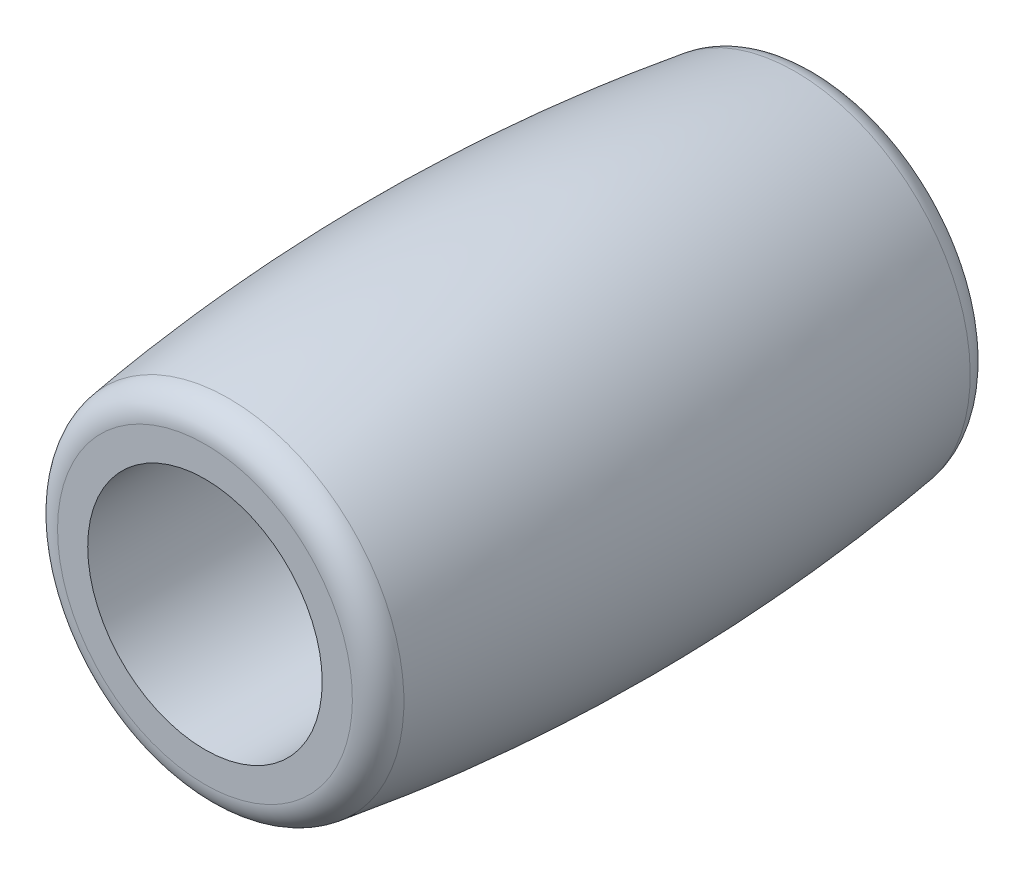
ISO-10303-21;
HEADER;
FILE_DESCRIPTION(('STEP AP214'),'2;1');
FILE_NAME('part.step','',(''),(''),'','','');
FILE_SCHEMA(('AUTOMOTIVE_DESIGN { 1 0 10303 214 1 1 1 1 }'));
ENDSEC;
DATA;
#1=APPLICATION_CONTEXT('core data for automotive mechanical design processes');
#2=APPLICATION_PROTOCOL_DEFINITION('international standard','automotive_design',2000,#1);
#3=PRODUCT_CONTEXT('',#1,'mechanical');
#4=PRODUCT('Part','Part','',(#3));
#5=PRODUCT_RELATED_PRODUCT_CATEGORY('part','',(#4));
#6=PRODUCT_DEFINITION_FORMATION('','',#4);
#7=PRODUCT_DEFINITION_CONTEXT('part definition',#1,'design');
#8=PRODUCT_DEFINITION('design','',#6,#7);
#9=PRODUCT_DEFINITION_SHAPE('','',#8);
#10=(LENGTH_UNIT() NAMED_UNIT(*) SI_UNIT(.MILLI.,.METRE.));
#11=(NAMED_UNIT(*) PLANE_ANGLE_UNIT() SI_UNIT($,.RADIAN.));
#12=(NAMED_UNIT(*) SI_UNIT($,.STERADIAN.) SOLID_ANGLE_UNIT());
#13=UNCERTAINTY_MEASURE_WITH_UNIT(LENGTH_MEASURE(1.E-05),#10,'distance_accuracy_value','');
#14=(GEOMETRIC_REPRESENTATION_CONTEXT(3) GLOBAL_UNCERTAINTY_ASSIGNED_CONTEXT((#13)) GLOBAL_UNIT_ASSIGNED_CONTEXT((#10,
#11,#12)) REPRESENTATION_CONTEXT('',''));
#15=CARTESIAN_POINT('',(0.,0.,0.));
#16=DIRECTION('',(0.,0.,1.));
#17=DIRECTION('',(1.,0.,0.));
#18=AXIS2_PLACEMENT_3D('',#15,#16,#17);
#19=CARTESIAN_POINT('',(0.,0.,6.27));
#20=DIRECTION('',(0.,0.,-1.));
#21=DIRECTION('',(-1.,0.,0.));
#22=AXIS2_PLACEMENT_3D('',#19,#20,#21);
#23=CYLINDRICAL_SURFACE('',#22,1.65);
#24=CARTESIAN_POINT('',(0.,0.,-0.65));
#25=DIRECTION('',(0.,0.,-1.));
#26=DIRECTION('',(-1.,0.,0.));
#27=AXIS2_PLACEMENT_3D('',#24,#25,#26);
#28=CIRCLE('',#27,1.65);
#29=CARTESIAN_POINT('',(-1.65,0.,-0.65));
#30=VERTEX_POINT('',#29);
#31=EDGE_CURVE('E22',#30,#30,#28,.T.);
#32=ORIENTED_EDGE('',*,*,#31,.F.);
#33=EDGE_LOOP('',(#32));
#34=FACE_BOUND('',#33,.T.);
#35=CARTESIAN_POINT('',(0.,0.,-4.15));
#36=DIRECTION('',(0.,0.,-1.));
#37=DIRECTION('',(-1.,0.,0.));
#38=AXIS2_PLACEMENT_3D('',#35,#36,#37);
#39=CIRCLE('',#38,1.65);
#40=CARTESIAN_POINT('',(-1.65,0.,-4.15));
#41=VERTEX_POINT('',#40);
#42=EDGE_CURVE('E125',#41,#41,#39,.T.);
#43=ORIENTED_EDGE('',*,*,#42,.T.);
#44=EDGE_LOOP('',(#43));
#45=FACE_BOUND('',#44,.T.);
#46=ADVANCED_FACE('F17',(#34,#45),#23,.F.);
#47=CARTESIAN_POINT('',(0.,0.,-0.65));
#48=DIRECTION('',(0.,0.,1.));
#49=DIRECTION('',(1.,0.,0.));
#50=AXIS2_PLACEMENT_3D('',#47,#48,#49);
#51=PLANE('',#50);
#52=CARTESIAN_POINT('',(0.,0.,-0.65));
#53=DIRECTION('',(0.,0.,1.));
#54=DIRECTION('',(1.,0.,0.));
#55=AXIS2_PLACEMENT_3D('',#52,#53,#54);
#56=CIRCLE('',#55,2.1);
#57=CARTESIAN_POINT('',(2.1,0.,-0.65));
#58=VERTEX_POINT('',#57);
#59=EDGE_CURVE('E123',#58,#58,#56,.T.);
#60=ORIENTED_EDGE('',*,*,#59,.T.);
#61=EDGE_LOOP('',(#60));
#62=FACE_BOUND('',#61,.T.);
#63=ORIENTED_EDGE('',*,*,#31,.T.);
#64=EDGE_LOOP('',(#63));
#65=FACE_BOUND('',#64,.T.);
#66=ADVANCED_FACE('F132',(#62,#65),#51,.T.);
#67=CARTESIAN_POINT('',(0.,0.,-4.15));
#68=DIRECTION('',(0.,0.,1.));
#69=DIRECTION('',(1.,0.,0.));
#70=AXIS2_PLACEMENT_3D('',#67,#68,#69);
#71=PLANE('',#70);
#72=CARTESIAN_POINT('',(0.,0.,-4.15));
#73=DIRECTION('',(0.,0.,1.));
#74=DIRECTION('',(1.,0.,0.));
#75=AXIS2_PLACEMENT_3D('',#72,#73,#74);
#76=CIRCLE('',#75,2.1);
#77=CARTESIAN_POINT('',(2.1,0.,-4.15));
#78=VERTEX_POINT('',#77);
#79=EDGE_CURVE('E68',#78,#78,#76,.F.);
#80=ORIENTED_EDGE('',*,*,#79,.T.);
#81=EDGE_LOOP('',(#80));
#82=FACE_BOUND('',#81,.T.);
#83=ORIENTED_EDGE('',*,*,#42,.F.);
#84=EDGE_LOOP('',(#83));
#85=FACE_BOUND('',#84,.T.);
#86=ADVANCED_FACE('F138',(#82,#85),#71,.F.);
#87=CARTESIAN_POINT('',(0.,0.,-9.568995074674));
#88=DIRECTION('',(0.,0.,1.));
#89=DIRECTION('',(1.,0.,0.));
#90=AXIS2_PLACEMENT_3D('',#87,#88,#89);
#91=CYLINDRICAL_SURFACE('',#90,2.1);
#92=ORIENTED_EDGE('',*,*,#59,.F.);
#93=EDGE_LOOP('',(#92));
#94=FACE_BOUND('',#93,.T.);
#95=CARTESIAN_POINT('',(0.,0.,5.5));
#96=DIRECTION('',(0.,0.,1.));
#97=DIRECTION('',(1.,0.,0.));
#98=AXIS2_PLACEMENT_3D('',#95,#96,#97);
#99=CIRCLE('',#98,2.1);
#100=CARTESIAN_POINT('',(2.1,0.,5.5));
#101=VERTEX_POINT('',#100);
#102=EDGE_CURVE('E62',#101,#101,#99,.T.);
#103=ORIENTED_EDGE('',*,*,#102,.T.);
#104=EDGE_LOOP('',(#103));
#105=FACE_BOUND('',#104,.T.);
#106=ADVANCED_FACE('F143',(#94,#105),#91,.F.);
#107=CARTESIAN_POINT('',(0.,0.,-9.568995074674));
#108=DIRECTION('',(0.,0.,1.));
#109=DIRECTION('',(1.,0.,0.));
#110=AXIS2_PLACEMENT_3D('',#107,#108,#109);
#111=CYLINDRICAL_SURFACE('',#110,2.1);
#112=ORIENTED_EDGE('',*,*,#79,.F.);
#113=EDGE_LOOP('',(#112));
#114=FACE_BOUND('',#113,.T.);
#115=CARTESIAN_POINT('',(0.,0.,-5.5));
#116=DIRECTION('',(0.,0.,1.));
#117=DIRECTION('',(1.,0.,0.));
#118=AXIS2_PLACEMENT_3D('',#115,#116,#117);
#119=CIRCLE('',#118,2.1);
#120=CARTESIAN_POINT('',(2.1,0.,-5.5));
#121=VERTEX_POINT('',#120);
#122=EDGE_CURVE('E61',#121,#121,#119,.T.);
#123=ORIENTED_EDGE('',*,*,#122,.F.);
#124=EDGE_LOOP('',(#123));
#125=FACE_BOUND('',#124,.T.);
#126=ADVANCED_FACE('F149',(#114,#125),#111,.F.);
#127=CARTESIAN_POINT('',(0.,0.,5.5));
#128=DIRECTION('',(0.,0.,-1.));
#129=DIRECTION('',(-1.,0.,0.));
#130=AXIS2_PLACEMENT_3D('',#127,#128,#129);
#131=PLANE('',#130);
#132=CARTESIAN_POINT('',(0.0248773712918905,2.6401190577732,5.49999999999906));
#133=CARTESIAN_POINT('',(0.0678825292685647,2.63970194219866,5.49999999965874));
#134=CARTESIAN_POINT('',(0.11087744662233,2.6382373654633,5.49999999946538));
#135=CARTESIAN_POINT('',(0.196745080248834,2.63322060772779,5.49999999936946));
#136=CARTESIAN_POINT('',(0.239617797216078,2.62966843861596,5.4999999994669));
#137=CARTESIAN_POINT('',(0.325140050623913,2.62048378260373,5.49999999994945));
#138=CARTESIAN_POINT('',(0.367789585767247,2.61485128362489,5.50000000033457));
#139=CARTESIAN_POINT('',(0.452765277199995,2.60151975256155,5.49999999885007));
#140=CARTESIAN_POINT('',(0.495091427879994,2.59382068471374,5.49999999698043));
#141=CARTESIAN_POINT('',(0.57870634373114,2.57650012149177,5.49999998771025));
#142=CARTESIAN_POINT('',(0.620001243023356,2.56690821945822,5.49999998039057));
#143=CARTESIAN_POINT('',(0.702086746036834,2.54575990910316,5.49999995207553));
#144=CARTESIAN_POINT('',(0.742877329746976,2.5342034230941,5.49999993107962));
#145=CARTESIAN_POINT('',(0.825262718177963,2.50870210420609,5.4999998768148));
#146=CARTESIAN_POINT('',(0.866836152712255,2.49468818489835,5.49999984314443));
#147=CARTESIAN_POINT('',(0.94922970312602,2.46458836798617,5.49999978498696));
#148=CARTESIAN_POINT('',(0.990049788430737,2.44850238649738,5.49999976050024));
#149=CARTESIAN_POINT('',(1.05481261683128,2.4210863494598,5.49999973176874));
#150=CARTESIAN_POINT('',(1.07902982230877,2.4103994755696,5.49999972334764));
#151=CARTESIAN_POINT('',(1.12713023414468,2.38829702713981,5.49999971244161));
#152=CARTESIAN_POINT('',(1.15101343791334,2.37688144695385,5.49999970995673));
#153=CARTESIAN_POINT('',(1.19842351788538,2.35333268205495,5.49999971070859));
#154=CARTESIAN_POINT('',(1.22195039356511,2.34119949628758,5.49999971394535));
#155=CARTESIAN_POINT('',(1.26862474564023,2.31622594754933,5.49999972726442));
#156=CARTESIAN_POINT('',(1.29177222386021,2.30338558798067,5.4999997373467));
#157=CARTESIAN_POINT('',(1.35581550161252,2.26658707183467,5.49999976636782));
#158=CARTESIAN_POINT('',(1.39627581023444,2.2418645533716,5.49999978600711));
#159=CARTESIAN_POINT('',(1.4732289494043,2.19195678768822,5.49999981715837));
#160=CARTESIAN_POINT('',(1.5098089552594,2.16690540166688,5.49999982911462));
#161=CARTESIAN_POINT('',(1.58838939830239,2.11013673975761,5.49999985133923));
#162=CARTESIAN_POINT('',(1.63012345617254,2.07804923736932,5.49999986087325));
#163=CARTESIAN_POINT('',(1.70764806033583,2.01467816419841,5.49999987338961));
#164=CARTESIAN_POINT('',(1.7436223360885,1.98361881376326,5.49999987691801));
#165=CARTESIAN_POINT('',(1.81007380725329,1.92305066163011,5.49999987855528));
#166=CARTESIAN_POINT('',(1.84072624654273,1.89373402427693,5.4999998772059));
#167=CARTESIAN_POINT('',(1.89698522904242,1.83728349253782,5.49999986782625));
#168=CARTESIAN_POINT('',(1.92275488793358,1.81031191558711,5.49999986062013));
#169=CARTESIAN_POINT('',(1.97251043058174,1.75598942908794,5.49999983903495));
#170=CARTESIAN_POINT('',(1.99652471124299,1.72866454500394,5.49999982483835));
#171=CARTESIAN_POINT('',(2.03912084517071,1.67816090079703,5.49999977581194));
#172=CARTESIAN_POINT('',(2.05789131451434,1.65514075503776,5.49999974524343));
#173=CARTESIAN_POINT('',(2.0991245110865,1.60280237462886,5.49999966084231));
#174=CARTESIAN_POINT('',(2.12137362566278,1.57331523184152,5.49999960315776));
#175=CARTESIAN_POINT('',(2.16459943079912,1.51342199746137,5.49999950566362));
#176=CARTESIAN_POINT('',(2.18557607365403,1.48301587147971,5.4999994658547));
#177=CARTESIAN_POINT('',(2.22961308202671,1.41620314693655,5.49999939857076));
#178=CARTESIAN_POINT('',(2.25243807664387,1.37964106188851,5.49999937425704));
#179=CARTESIAN_POINT('',(2.29625436637253,1.30543451647691,5.49999935735805));
#180=CARTESIAN_POINT('',(2.31724565529749,1.2677900524622,5.49999936477288));
#181=CARTESIAN_POINT('',(2.35734382842754,1.19151176530245,5.49999940893279));
#182=CARTESIAN_POINT('',(2.37645074719522,1.15287796032,5.49999944567732));
#183=CARTESIAN_POINT('',(2.41273314745824,1.07471385542079,5.49999954093811));
#184=CARTESIAN_POINT('',(2.42990870630492,1.03518359148364,5.49999959945349));
#185=CARTESIAN_POINT('',(2.45534873572827,0.972441011274,5.49999969528873));
#186=CARTESIAN_POINT('',(2.46427762386869,0.949495725238715,5.49999973094502));
#187=CARTESIAN_POINT('',(2.48148136870957,0.903361643404628,5.49999980256492));
#188=CARTESIAN_POINT('',(2.48975625312507,0.880172857971947,5.49999983852851));
#189=CARTESIAN_POINT('',(2.50364654883084,0.839471903891961,5.49999988878231));
#190=CARTESIAN_POINT('',(2.50940501359574,0.822008342273786,5.49999990625417));
#191=CARTESIAN_POINT('',(2.52056885299956,0.786969660155429,5.49999993039598));
#192=CARTESIAN_POINT('',(2.52597424073568,0.769394543819874,5.49999993706632));
#193=CARTESIAN_POINT('',(2.5433946081392,0.710636277790279,5.49999995213459));
#194=CARTESIAN_POINT('',(2.55461472196398,0.669214670584245,5.49999995098151));
#195=CARTESIAN_POINT('',(2.57509161784409,0.585887187816785,5.49999990044406));
#196=CARTESIAN_POINT('',(2.58434836506111,0.543981303676173,5.49999985105882));
#197=CARTESIAN_POINT('',(2.59495370837411,0.489852962126623,5.49999973296503));
#198=CARTESIAN_POINT('',(2.59722835522908,0.47780746551927,5.49999970325198));
#199=CARTESIAN_POINT('',(2.60163059904037,0.453688727502332,5.49999960660272));
#200=CARTESIAN_POINT('',(2.60375819130425,0.441615485220086,5.49999953966531));
#201=CARTESIAN_POINT('',(2.60916026308902,0.409204400311767,5.49999946224456));
#202=CARTESIAN_POINT('',(2.61223009499615,0.388832716082163,5.49999952116365));
#203=CARTESIAN_POINT('',(2.62236747862494,0.315929966602943,5.49999969458008));
#204=CARTESIAN_POINT('',(2.62812903078423,0.26321076476967,5.49999975074797));
#205=CARTESIAN_POINT('',(2.63568216238587,0.167155259340928,5.49999985232321));
#206=CARTESIAN_POINT('',(2.63800584558196,0.123859713067016,5.49999989782634));
#207=CARTESIAN_POINT('',(2.64020828811222,0.0495530968176275,5.4999999374597));
#208=CARTESIAN_POINT('',(2.64059496224781,0.0185560032729341,5.49999994253187));
#209=CARTESIAN_POINT('',(2.64024020424809,-0.0555133709522384,5.49999994384453));
#210=CARTESIAN_POINT('',(2.63900050291251,-0.0985845912879579,5.4999999358737));
#211=CARTESIAN_POINT('',(2.63440348557629,-0.184613352918136,5.4999999245519));
#212=CARTESIAN_POINT('',(2.63104614996624,-0.227570893156212,5.49999992120098));
#213=CARTESIAN_POINT('',(2.62223628463875,-0.313271053055163,5.49999991332979));
#214=CARTESIAN_POINT('',(2.61678373721125,-0.356013670896285,5.49999990880952));
#215=CARTESIAN_POINT('',(2.60379262141174,-0.441181060257339,5.49999990026866));
#216=CARTESIAN_POINT('',(2.59625403709144,-0.483605829344689,5.49999989624807));
#217=CARTESIAN_POINT('',(2.57910992105077,-0.568035945076684,5.49999988836561));
#218=CARTESIAN_POINT('',(2.56950437519669,-0.610041288851277,5.49999988450374));
#219=CARTESIAN_POINT('',(2.54824905592143,-0.693531824564453,5.4999998771248));
#220=CARTESIAN_POINT('',(2.53659927017222,-0.735017013364566,5.49999987360774));
#221=CARTESIAN_POINT('',(2.51128344631799,-0.817367798347162,5.49999986695173));
#222=CARTESIAN_POINT('',(2.49761739768135,-0.858233391292057,5.4999998638128));
#223=CARTESIAN_POINT('',(2.46830176580158,-0.9392470174863,5.4999998579758));
#224=CARTESIAN_POINT('',(2.45265217379895,-0.979395047565937,5.49999985527773));
#225=CARTESIAN_POINT('',(2.41940695643542,-1.0588773041899,5.49999985036578));
#226=CARTESIAN_POINT('',(2.40181132405155,-1.09821152779671,5.4999998481519));
#227=CARTESIAN_POINT('',(2.36471618869863,-1.17597187805597,5.49999984424532));
#228=CARTESIAN_POINT('',(2.34521668039563,-1.2143980021639,5.49999984255262));
#229=CARTESIAN_POINT('',(2.30436052491069,-1.29025003780763,5.49999983971556));
#230=CARTESIAN_POINT('',(2.28300387402488,-1.32767594734841,5.49999983857119));
#231=CARTESIAN_POINT('',(2.23848461957383,-1.40143783688484,5.49999983684906));
#232=CARTESIAN_POINT('',(2.21532201386461,-1.43777381558648,5.4999998362713));
#233=CARTESIAN_POINT('',(2.16724636823316,-1.50926874055006,5.49999983569149));
#234=CARTESIAN_POINT('',(2.14233332764586,-1.54442768636479,5.49999983568944));
#235=CARTESIAN_POINT('',(2.09081652957835,-1.61348426580029,5.49999983626109));
#236=CARTESIAN_POINT('',(2.06421277282058,-1.64738189996001,5.49999983683479));
#237=CARTESIAN_POINT('',(2.00937831529629,-1.71383460177808,5.49999983854888));
#238=CARTESIAN_POINT('',(1.98114761653835,-1.74638967109384,5.49999983968926));
#239=CARTESIAN_POINT('',(1.92312695037514,-1.81007920939641,5.49999984251857));
#240=CARTESIAN_POINT('',(1.89333698615369,-1.84121368128367,5.49999984420749));
#241=CARTESIAN_POINT('',(1.83226920445708,-1.90198739868093,5.49999984810661));
#242=CARTESIAN_POINT('',(1.80099139122113,-1.93162664845065,5.49999985031681));
#243=CARTESIAN_POINT('',(1.73702289548948,-1.98933888245701,5.49999985522215));
#244=CARTESIAN_POINT('',(1.7043322181601,-2.01741187241999,5.49999985791729));
#245=CARTESIAN_POINT('',(1.63761636683443,-2.07192430504666,5.49999986374708));
#246=CARTESIAN_POINT('',(1.60359119879543,-2.09836375500124,5.49999986688172));
#247=CARTESIAN_POINT('',(1.53428793910248,-2.1495457447061,5.49999987353597));
#248=CARTESIAN_POINT('',(1.49900985405344,-2.1742882933998,5.49999987705558));
#249=CARTESIAN_POINT('',(1.42728533802588,-2.2220171885956,5.49999988441615));
#250=CARTESIAN_POINT('',(1.39083891415003,-2.24500354577124,5.4999998882571));
#251=CARTESIAN_POINT('',(1.31686509974742,-2.28916497914276,5.49999989618763));
#252=CARTESIAN_POINT('',(1.27933771666532,-2.31034006780903,5.49999990027721));
#253=CARTESIAN_POINT('',(1.20329195495375,-2.3508282307175,5.49999990862318));
#254=CARTESIAN_POINT('',(1.16477358394999,-2.3701413192825,5.49999991287957));
#255=CARTESIAN_POINT('',(1.08683819333554,-2.40685921565179,5.49999992146826));
#256=CARTESIAN_POINT('',(1.04742118136625,-2.42426403967528,5.49999992580055));
#257=CARTESIAN_POINT('',(0.967783009895892,-2.4571237185497,5.49999993444104));
#258=CARTESIAN_POINT('',(0.927561857882819,-2.47257859154839,5.49999993874923));
#259=CARTESIAN_POINT('',(0.846411834701846,-2.50150135851016,5.49999994723243));
#260=CARTESIAN_POINT('',(0.805482970696529,-2.51496927256964,5.49999995140743));
#261=CARTESIAN_POINT('',(0.723015647602721,-2.53988587672212,5.49999995950605));
#262=CARTESIAN_POINT('',(0.681477195177259,-2.55133458886798,5.49999996342968));
#263=CARTESIAN_POINT('',(0.597890279889404,-2.57218539533317,5.49999997089825));
#264=CARTESIAN_POINT('',(0.555841823014981,-2.58158751365709,5.49999997444319));
#265=CARTESIAN_POINT('',(0.471335703353399,-2.59832262237008,5.49999998101807));
#266=CARTESIAN_POINT('',(0.428878045703116,-2.6056556386986,5.49999998404801));
#267=CARTESIAN_POINT('',(0.343655313007517,-2.61823509402677,5.49999998944725));
#268=CARTESIAN_POINT('',(0.300890242072128,-2.62348156086969,5.49999999181656));
#269=CARTESIAN_POINT('',(0.215155188201054,-2.63187511111472,5.4999999957405));
#270=CARTESIAN_POINT('',(0.172185208173876,-2.63502222422654,5.49999999729514));
#271=CARTESIAN_POINT('',(0.0861433973167787,-2.63921064849215,5.49999999942415));
#272=CARTESIAN_POINT('',(0.0430715680201314,-2.64025199114737,5.49999999999854));
#273=CARTESIAN_POINT('',(-1.43796054973174E-11,-2.6402372271348,5.5));
#274=B_SPLINE_CURVE_WITH_KNOTS('',3,(#132,#133,#134,#135,#136,#137,#138,#139,#140,#141,#142,
#143,#144,#145,#146,#147,#148,#149,#150,#151,#152,#153,#154,#155,#156,#157,#158,#159,#160,#161,
#162,#163,#164,#165,#166,#167,#168,#169,#170,#171,#172,#173,#174,#175,#176,#177,#178,#179,#180,
#181,#182,#183,#184,#185,#186,#187,#188,#189,#190,#191,#192,#193,#194,#195,#196,#197,#198,#199,
#200,#201,#202,#203,#204,#205,#206,#207,#208,#209,#210,#211,#212,#213,#214,#215,#216,#217,#218,
#219,#220,#221,#222,#223,#224,#225,#226,#227,#228,#229,#230,#231,#232,#233,#234,#235,#236,#237,
#238,#239,#240,#241,#242,#243,#244,#245,#246,#247,#248,#249,#250,#251,#252,#253,#254,#255,#256,
#257,#258,#259,#260,#261,#262,#263,#264,#265,#266,#267,#268,#269,#270,#271,#272,#273),
.UNSPECIFIED.,.F.,.F.,(4,2,2,2,2,2,2,2,2,2,2,2,2,2,2,2,2,2,2,2,2,2,2,2,2,2,2,2,2,2,2,2,2,2,2,2,
2,2,2,2,2,2,2,2,2,2,2,2,2,2,2,2,2,2,2,2,2,2,2,2,2,2,2,2,2,2,2,2,2,2,4),(0.,0.129008731699863,
0.258016728733516,0.387025474801639,0.516036453592958,0.643170796976209,0.770310168932755,
0.901871368765264,1.03343789633251,1.11283841165064,1.19223954227657,1.27164078957471,
1.35104165490653,1.4932127184999,1.62616855663192,1.78400055007074,1.92651438782586,
2.05371024758647,2.16558804826695,2.27468936334088,2.36378287633756,2.47456631118193,
2.58535389674951,2.71460548149108,2.84385750228337,2.9731071519299,3.10235162325697,
3.17620725764527,3.25005976053756,3.30522148424376,3.36038116059174,3.48907347828909,
3.61776807933489,3.65454284638579,3.69131878635972,3.75311777612348,3.91211171154272,
4.04213354736535,4.13511625270373,4.26432934201404,4.39354362786205,4.52275900593487,
4.65197537191959,4.78119262150333,4.91041065037323,5.03962935421643,5.16884862872008,
5.29806836957136,5.42728847245746,5.55650883306555,5.68572934708286,5.81494991019658,
5.94417041809395,6.07339076646219,6.20261085098854,6.33183056736025,6.46104981126455,
6.59026847838872,6.71948646442,6.84870366504565,6.97791997595295,7.10713529282915,
7.23634951136153,7.36556252723737,7.49477423614395,7.62398453376856,7.75319331579848,
7.88240047792104,8.01160591582354,8.14080952519331,8.2700112017177),.UNSPECIFIED.);
#275=CARTESIAN_POINT('',(0.0248773758503119,2.64011954153627,5.49999999999953));
#276=VERTEX_POINT('',#275);
#277=CARTESIAN_POINT('',(-1.43819504990454E-11,-2.6402372271348,5.5));
#278=VERTEX_POINT('',#277);
#279=EDGE_CURVE('E55',#276,#278,#274,.T.);
#280=ORIENTED_EDGE('',*,*,#279,.F.);
#281=CARTESIAN_POINT('',(0.,0.,5.49999999999976));
#282=DIRECTION('',(0.,0.,-1.));
#283=DIRECTION('',(-1.,0.,0.));
#284=AXIS2_PLACEMENT_3D('',#281,#282,#283);
#285=CIRCLE('',#284,2.64023674613928);
#286=EDGE_CURVE('E51',#278,#276,#285,.T.);
#287=ORIENTED_EDGE('',*,*,#286,.F.);
#288=EDGE_LOOP('',(#280,#287));
#289=FACE_BOUND('',#288,.T.);
#290=ORIENTED_EDGE('',*,*,#102,.F.);
#291=EDGE_LOOP('',(#290));
#292=FACE_BOUND('',#291,.T.);
#293=ADVANCED_FACE('F53',(#289,#292),#131,.F.);
#294=CARTESIAN_POINT('',(0.,0.,-5.5));
#295=DIRECTION('',(0.,0.,-1.));
#296=DIRECTION('',(-1.,0.,0.));
#297=AXIS2_PLACEMENT_3D('',#294,#295,#296);
#298=PLANE('',#297);
#299=DIRECTION('',(-0.999994771918287,0.00323359491781462,0.));
#300=VECTOR('',#299,1.);
#301=CARTESIAN_POINT('',(6.35729872237665E-12,-2.6402372353868,-5.5));
#302=LINE('',#301,#300);
#303=CARTESIAN_POINT('',(6.35729872237665E-12,-2.6402372353868,-5.5));
#304=VERTEX_POINT('',#303);
#305=CARTESIAN_POINT('',(-0.0168387956405293,-2.64018297292811,-5.49999999999993));
#306=VERTEX_POINT('',#305);
#307=EDGE_CURVE('E37',#304,#306,#302,.T.);
#308=ORIENTED_EDGE('',*,*,#307,.T.);
#309=CARTESIAN_POINT('',(2.73689899525599E-12,2.6402372353868,-5.5));
#310=CARTESIAN_POINT('',(-0.0353602649512448,2.64022328716767,-5.49999999998965));
#311=CARTESIAN_POINT('',(-0.0707202138149778,2.63949906925626,-5.49999999938122));
#312=CARTESIAN_POINT('',(-0.141382113955793,2.63663306133205,-5.49999999735737));
#313=CARTESIAN_POINT('',(-0.17668406605467,2.63449129158224,-5.49999999594196));
#314=CARTESIAN_POINT('',(-0.24717318956793,2.62879318160423,-5.49999999269333));
#315=CARTESIAN_POINT('',(-0.282360362383326,2.62523685870789,-5.49999999086011));
#316=CARTESIAN_POINT('',(-0.352563354146342,2.61671552514399,-5.49999998709151));
#317=CARTESIAN_POINT('',(-0.387579174839853,2.61175052885979,-5.49999998515613));
#318=CARTESIAN_POINT('',(-0.457383158926389,2.60041982639402,-5.49999998144503));
#319=CARTESIAN_POINT('',(-0.492171324176623,2.59405413165403,-5.49999997966931));
#320=CARTESIAN_POINT('',(-0.561464061978956,2.57993230054772,-5.49999997648026));
#321=CARTESIAN_POINT('',(-0.595968636267067,2.57217617269964,-5.49999997506692));
#322=CARTESIAN_POINT('',(-0.664638712051735,2.55528596182629,-5.49999997274765));
#323=CARTESIAN_POINT('',(-0.698804214932484,2.54615188442869,-5.49999997184171));
#324=CARTESIAN_POINT('',(-0.766741212478748,2.52652047403475,-5.49999997062421));
#325=CARTESIAN_POINT('',(-0.800512707948618,2.51602314382198,-5.49999997031264));
#326=CARTESIAN_POINT('',(-0.867607387543148,2.4936821128788,-5.49999997031285));
#327=CARTESIAN_POINT('',(-0.900930571667657,2.48183841214794,-5.49999997062463));
#328=CARTESIAN_POINT('',(-0.967075045010568,2.45682368511733,-5.49999997184254));
#329=CARTESIAN_POINT('',(-0.999896333203707,2.44365265610656,-5.49999997274866));
#330=CARTESIAN_POINT('',(-1.06498423504602,2.41600444538314,-5.49999997506827));
#331=CARTESIAN_POINT('',(-1.09725084642899,2.4015272583355,-5.49999997648176));
#332=CARTESIAN_POINT('',(-1.16117750843789,2.37129000297296,-5.49999997967108));
#333=CARTESIAN_POINT('',(-1.19283755534633,2.35552992679863,-5.49999998144692));
#334=CARTESIAN_POINT('',(-1.25550015974498,2.32275220937675,-5.49999998515804));
#335=CARTESIAN_POINT('',(-1.2865027118621,2.3057345578573,-5.49999998709333));
#336=CARTESIAN_POINT('',(-1.34780050753665,2.27046907206974,-5.49999999086214));
#337=CARTESIAN_POINT('',(-1.37809574386852,2.25222122524204,-5.49999999269566));
#338=CARTESIAN_POINT('',(-1.43793001502288,2.21452452270258,-5.49999999594295));
#339=CARTESIAN_POINT('',(-1.46746904057509,2.19507565227763,-5.49999999735672));
#340=CARTESIAN_POINT('',(-1.52574398336453,2.1550086827302,-5.49999999938395));
#341=CARTESIAN_POINT('',(-1.55447988911536,2.13439056689767,-5.49999999999741));
#342=CARTESIAN_POINT('',(-1.60969501126553,2.09306777759811,-5.50000000000246));
#343=CARTESIAN_POINT('',(-1.63621545529843,2.07241815437379,-5.49999999945318));
#344=CARTESIAN_POINT('',(-1.69023585411397,2.02867060963557,-5.49999999773969));
#345=CARTESIAN_POINT('',(-1.71767849975681,2.00550186787581,-5.49999999653594));
#346=CARTESIAN_POINT('',(-1.77332268497341,1.95654241454565,-5.49999999379952));
#347=CARTESIAN_POINT('',(-1.80146012678241,1.9306788289331,-5.49999999225072));
#348=CARTESIAN_POINT('',(-1.85824494523499,1.87615919714708,-5.49999998907417));
#349=CARTESIAN_POINT('',(-1.8868209567381,1.84742878581862,-5.49999998744728));
#350=CARTESIAN_POINT('',(-1.94420446353959,1.78701336034399,-5.49999998432007));
#351=CARTESIAN_POINT('',(-1.97293289128357,1.75525321829588,-5.49999998283219));
#352=CARTESIAN_POINT('',(-2.03031211836799,1.68862818665799,-5.49999998014482));
#353=CARTESIAN_POINT('',(-2.05887574364608,1.65368817424705,-5.49999997896514));
#354=CARTESIAN_POINT('',(-2.11558405721529,1.58057141710238,-5.49999997701076));
#355=CARTESIAN_POINT('',(-2.14363306525662,1.54232048000365,-5.49999997625979));
#356=CARTESIAN_POINT('',(-2.19894117671992,1.46246808157144,-5.49999997523388));
#357=CARTESIAN_POINT('',(-2.22609589503544,1.42079410549182,-5.49999997498381));
#358=CARTESIAN_POINT('',(-2.26547749293814,1.35645182974235,-5.49999997498362));
#359=CARTESIAN_POINT('',(-2.27858424889529,1.33431716735072,-5.49999997505046));
#360=CARTESIAN_POINT('',(-2.30443136078407,1.28917412091018,-5.49999997531018));
#361=CARTESIAN_POINT('',(-2.31715696448412,1.26615726790262,-5.49999997550584));
#362=CARTESIAN_POINT('',(-2.34218523179829,1.21924605375276,-5.49999997601892));
#363=CARTESIAN_POINT('',(-2.35447255230148,1.19534351129454,-5.49999997633891));
#364=CARTESIAN_POINT('',(-2.37856665382948,1.14665860144083,-5.49999997709324));
#365=CARTESIAN_POINT('',(-2.3903575161994,1.12186835334098,-5.49999997752988));
#366=CARTESIAN_POINT('',(-2.41339913777458,1.07140878127226,-5.49999997850711));
#367=CARTESIAN_POINT('',(-2.42463339786595,1.04573192254346,-5.49999997904969));
#368=CARTESIAN_POINT('',(-2.44650065027743,0.993502768376487,-5.4999999802254));
#369=CARTESIAN_POINT('',(-2.45711656597616,0.966943322118939,-5.49999998086015));
#370=CARTESIAN_POINT('',(-2.47768439690554,0.912955840199923,-5.4999999822038));
#371=CARTESIAN_POINT('',(-2.48761866138476,0.885521078990326,-5.49999998291392));
#372=CARTESIAN_POINT('',(-2.50675903517294,0.829793205859471,-5.49999998438886));
#373=CARTESIAN_POINT('',(-2.51594692559482,0.801493835338733,-5.49999998515448));
#374=CARTESIAN_POINT('',(-2.53352911227797,0.744050595150123,-5.49999998671797));
#375=CARTESIAN_POINT('',(-2.54190462971272,0.714900976560879,-5.49999998751617));
#376=CARTESIAN_POINT('',(-2.55779551095218,0.655774913297164,-5.49999998911935));
#377=CARTESIAN_POINT('',(-2.56529154667475,0.625793272816496,-5.49999998992416));
#378=CARTESIAN_POINT('',(-2.57935596680523,0.565024875436222,-5.49999999151206));
#379=CARTESIAN_POINT('',(-2.58590448715834,0.53423352004435,-5.49999999229446));
#380=CARTESIAN_POINT('',(-2.59800564103998,0.471871627334276,-5.49999999380601));
#381=CARTESIAN_POINT('',(-2.60353789051644,0.440297133236588,-5.49999999453393));
#382=CARTESIAN_POINT('',(-2.61353776171191,0.376399391810275,-5.49999999590196));
#383=CARTESIAN_POINT('',(-2.61798449838171,0.344072875451502,-5.49999999654026));
#384=CARTESIAN_POINT('',(-2.6257443093123,0.278705944732896,-5.49999999769148));
#385=CARTESIAN_POINT('',(-2.62903601891954,0.245662990680176,-5.499999998202));
#386=CARTESIAN_POINT('',(-2.63441684376788,0.178903655446913,-5.49999999905701));
#387=CARTESIAN_POINT('',(-2.636484141528,0.145185523203857,-5.49999999939847));
#388=CARTESIAN_POINT('',(-2.63934710964115,0.0771182496417608,-5.49999999987184));
#389=CARTESIAN_POINT('',(-2.64012053116892,0.0427681386769826,-5.50000000000007));
#390=CARTESIAN_POINT('',(-2.64022799262914,0.00702830220719433,-5.5));
#391=CARTESIAN_POINT('',(-2.64023107649174,0.00563697704158329,-5.49999999999978));
#392=CARTESIAN_POINT('',(-2.6402351424146,0.00283043870824231,-5.49999999999915));
#393=CARTESIAN_POINT('',(-2.64023608747934,0.00141522554157738,-5.49999999999873));
#394=CARTESIAN_POINT('',(-2.6402287685933,-0.0524070481069201,-5.49999999997905));
#395=CARTESIAN_POINT('',(-2.63866178964553,-0.10483106575894,-5.4999999998319));
#396=CARTESIAN_POINT('',(-2.63397571274593,-0.183312333621585,-5.49999999958044));
#397=CARTESIAN_POINT('',(-2.63202425299457,-0.209448350130384,-5.49999999949148));
#398=CARTESIAN_POINT('',(-2.62734457013648,-0.261652292606989,-5.49999999932246));
#399=CARTESIAN_POINT('',(-2.62461634857554,-0.287720218710193,-5.4999999992424));
#400=CARTESIAN_POINT('',(-2.61830354464358,-0.340447528343628,-5.49999999910395));
#401=CARTESIAN_POINT('',(-2.61469832296044,-0.3671044317879,-5.49999999904619));
#402=CARTESIAN_POINT('',(-2.60667557936102,-0.420295796226523,-5.49999999896506));
#403=CARTESIAN_POINT('',(-2.60225805805233,-0.446830257312442,-5.49999999894168));
#404=CARTESIAN_POINT('',(-2.59261482771993,-0.49975188609301,-5.49999999893298));
#405=CARTESIAN_POINT('',(-2.58738911877086,-0.526139053801262,-5.49999999894766));
#406=CARTESIAN_POINT('',(-2.57613438574141,-0.578741534165084,-5.4999999990128));
#407=CARTESIAN_POINT('',(-2.57010536120854,-0.604956846723846,-5.49999999906325));
#408=CARTESIAN_POINT('',(-2.55724961241128,-0.657191182135424,-5.49999999919161));
#409=CARTESIAN_POINT('',(-2.5504228871746,-0.683210204748947,-5.49999999926952));
#410=CARTESIAN_POINT('',(-2.53597810610271,-0.735027687869275,-5.49999999943864));
#411=CARTESIAN_POINT('',(-2.52836004878418,-0.760826147962545,-5.49999999952984));
#412=CARTESIAN_POINT('',(-2.51233966867504,-0.812178553407791,-5.4999999997049));
#413=CARTESIAN_POINT('',(-2.5039373439002,-0.837732498140955,-5.49999999978877));
#414=CARTESIAN_POINT('',(-2.48635637458693,-0.88857170989901,-5.49999999992433));
#415=CARTESIAN_POINT('',(-2.47717772757545,-0.913856976067712,-5.49999999997603));
#416=CARTESIAN_POINT('',(-2.45466897118196,-0.973030870884076,-5.50000000001575));
#417=CARTESIAN_POINT('',(-2.44101900387674,-1.00679831019646,-5.49999999997478));
#418=CARTESIAN_POINT('',(-2.41233410744485,-1.07374067120737,-5.49999999970256));
#419=CARTESIAN_POINT('',(-2.39729916945203,-1.10691558911115,-5.49999999947132));
#420=CARTESIAN_POINT('',(-2.37481890362558,-1.15391297969363,-5.49999999883167));
#421=CARTESIAN_POINT('',(-2.36792531094727,-1.16800142304019,-5.49999999859906));
#422=CARTESIAN_POINT('',(-2.35388950901277,-1.19605379423354,-5.49999999791621));
#423=CARTESIAN_POINT('',(-2.34674729904786,-1.21001772172523,-5.49999999746597));
#424=CARTESIAN_POINT('',(-2.31699428358706,-1.26693684759585,-5.49999999503632));
#425=CARTESIAN_POINT('',(-2.29332232476825,-1.30934437359397,-5.49999999182931));
#426=CARTESIAN_POINT('',(-2.24368748594358,-1.39279424774044,-5.49999997785436));
#427=CARTESIAN_POINT('',(-2.21772454512384,-1.43383655960948,-5.49999996708621));
#428=CARTESIAN_POINT('',(-2.16358391572341,-1.5144359426355,-5.49999993117951));
#429=CARTESIAN_POINT('',(-2.13540613870444,-1.55399295439124,-5.49999990604039));
#430=CARTESIAN_POINT('',(-2.07691883702476,-1.63150551011537,-5.49999983016042));
#431=CARTESIAN_POINT('',(-2.04660919872419,-1.6694609685394,-5.49999977941822));
#432=CARTESIAN_POINT('',(-2.00226984125299,-1.72195917453083,-5.49999968492205));
#433=CARTESIAN_POINT('',(-1.98908059532264,-1.73721834263441,-5.49999965442203));
#434=CARTESIAN_POINT('',(-1.96235919451239,-1.76743475417321,-5.49999958122799));
#435=CARTESIAN_POINT('',(-1.94882702934617,-1.78239198852732,-5.49999953853361));
#436=CARTESIAN_POINT('',(-1.91605187853578,-1.81777726164698,-5.49999944864256));
#437=CARTESIAN_POINT('',(-1.89664654211239,-1.83805544734038,-5.49999940622314));
#438=CARTESIAN_POINT('',(-1.85716834658316,-1.8779474778839,-5.49999938937087));
#439=CARTESIAN_POINT('',(-1.83709552744838,-1.8975613623731,-5.49999941493396));
#440=CARTESIAN_POINT('',(-1.78934808133372,-1.94271690730337,-5.49999953452625));
#441=CARTESIAN_POINT('',(-1.761420666477,-1.96799268581777,-5.49999964897451));
#442=CARTESIAN_POINT('',(-1.70441513671655,-2.01719656985863,-5.49999987176438));
#443=CARTESIAN_POINT('',(-1.67533726592486,-2.04112495870043,-5.49999998010726));
#444=CARTESIAN_POINT('',(-1.63727251260055,-2.07132730423863,-5.50000000357042));
#445=CARTESIAN_POINT('',(-1.62866361113064,-2.07808559664964,-5.50000000123408));
#446=CARTESIAN_POINT('',(-1.60232048391559,-2.09852871237055,-5.49999999740769));
#447=CARTESIAN_POINT('',(-1.5844660072261,-2.11205970323033,-5.49999999936274));
#448=CARTESIAN_POINT('',(-1.53920208346644,-2.14546653826429,-5.5000000007145));
#449=CARTESIAN_POINT('',(-1.51157554622919,-2.16504851769745,-5.49999999829165));
#450=CARTESIAN_POINT('',(-1.44612101019491,-2.20959184152479,-5.4999999852792));
#451=CARTESIAN_POINT('',(-1.4080040856826,-2.23413150444489,-5.49999997220371));
#452=CARTESIAN_POINT('',(-1.35676482054356,-2.26528319704997,-5.49999994416419));
#453=CARTESIAN_POINT('',(-1.34418048477567,-2.2727911762322,-5.49999993646366));
#454=CARTESIAN_POINT('',(-1.31888748044297,-2.28759564134378,-5.4999999205289));
#455=CARTESIAN_POINT('',(-1.3061788098425,-2.29489212380266,-5.49999991229466));
#456=CARTESIAN_POINT('',(-1.26787218628419,-2.31646139321433,-5.49999988691601));
#457=CARTESIAN_POINT('',(-1.24209329799223,-2.33041419892705,-5.49999986909549));
#458=CARTESIAN_POINT('',(-1.18535454491619,-2.35990780207275,-5.49999983066131));
#459=CARTESIAN_POINT('',(-1.15430490605694,-2.37527605305576,-5.49999981012894));
#460=CARTESIAN_POINT('',(-1.09162192292022,-2.40477368696791,-5.49999977228534));
#461=CARTESIAN_POINT('',(-1.05998856545071,-2.4189030418564,-5.49999975497417));
#462=CARTESIAN_POINT('',(-0.996187612588674,-2.4459007132496,-5.49999972557395));
#463=CARTESIAN_POINT('',(-0.964020008913494,-2.4587690101822,-5.49999971348497));
#464=CARTESIAN_POINT('',(-0.899201086366928,-2.48322431059641,-5.49999969580184));
#465=CARTESIAN_POINT('',(-0.866549763430483,-2.49481130330333,-5.49999969020773));
#466=CARTESIAN_POINT('',(-0.800814637186902,-2.51668579073997,-5.49999968608015));
#467=CARTESIAN_POINT('',(-0.767730833317871,-2.52697328378116,-5.49999968754669));
#468=CARTESIAN_POINT('',(-0.70118268062924,-2.54623261971134,-5.49999969739353));
#469=CARTESIAN_POINT('',(-0.667718334021608,-2.55520447024352,-5.49999970577379));
#470=CARTESIAN_POINT('',(-0.60046163001015,-2.5718184535405,-5.49999972859033));
#471=CARTESIAN_POINT('',(-0.566669276849422,-2.57946060348219,-5.49999974302653));
#472=CARTESIAN_POINT('',(-0.49880961391605,-2.59340322674723,-5.4999997763847));
#473=CARTESIAN_POINT('',(-0.464742309663834,-2.59970372693881,-5.49999979530656));
#474=CARTESIAN_POINT('',(-0.396386231968524,-2.61095320630557,-5.49999983535801));
#475=CARTESIAN_POINT('',(-0.362097464560716,-2.61590222215346,-5.49999985648753));
#476=CARTESIAN_POINT('',(-0.293352298612114,-2.62444107028903,-5.49999989795103));
#477=CARTESIAN_POINT('',(-0.258895905852574,-2.62803094912027,-5.49999991828503));
#478=CARTESIAN_POINT('',(-0.189869582431377,-2.63384586107229,-5.49999995449392));
#479=CARTESIAN_POINT('',(-0.155299656524461,-2.63607095063543,-5.499999970369));
#480=CARTESIAN_POINT('',(-0.0861005636606324,-2.63915335383241,-5.49999999309389));
#481=CARTESIAN_POINT('',(-0.0514713996563842,-2.64001073375787,-5.49999999994414));
#482=CARTESIAN_POINT('',(-0.0168387944505718,-2.64018278526195,-5.49999999999944));
#483=B_SPLINE_CURVE_WITH_KNOTS('',3,(#309,#310,#311,#312,#313,#314,#315,#316,#317,#318,#319,
#320,#321,#322,#323,#324,#325,#326,#327,#328,#329,#330,#331,#332,#333,#334,#335,#336,#337,#338,
#339,#340,#341,#342,#343,#344,#345,#346,#347,#348,#349,#350,#351,#352,#353,#354,#355,#356,#357,
#358,#359,#360,#361,#362,#363,#364,#365,#366,#367,#368,#369,#370,#371,#372,#373,#374,#375,#376,
#377,#378,#379,#380,#381,#382,#383,#384,#385,#386,#387,#388,#389,#390,#391,#392,#393,#394,#395,
#396,#397,#398,#399,#400,#401,#402,#403,#404,#405,#406,#407,#408,#409,#410,#411,#412,#413,#414,
#415,#416,#417,#418,#419,#420,#421,#422,#423,#424,#425,#426,#427,#428,#429,#430,#431,#432,#433,
#434,#435,#436,#437,#438,#439,#440,#441,#442,#443,#444,#445,#446,#447,#448,#449,#450,#451,#452,
#453,#454,#455,#456,#457,#458,#459,#460,#461,#462,#463,#464,#465,#466,#467,#468,#469,#470,#471,
#472,#473,#474,#475,#476,#477,#478,#479,#480,#481,#482),.UNSPECIFIED.,.F.,.F.,(4,2,2,2,2,2,2,2,
2,2,2,2,2,2,2,2,2,2,2,2,2,2,2,2,2,2,2,2,2,2,2,2,2,2,2,2,2,2,2,2,2,2,2,2,2,2,2,2,2,2,2,2,2,2,2,2,
2,2,2,2,2,2,2,2,2,2,2,2,2,2,2,2,2,2,2,2,2,2,2,2,2,2,2,2,2,2,4),(0.,0.106073639254447,
0.212145762288229,0.318216585709354,0.42428632612585,0.53035520014576,0.636423424377132,
0.742491215428022,0.848558789906486,0.954626364420583,1.06069415557837,1.16676237998791,
1.27283125425724,1.37890099499443,1.48497181880752,1.59104394230452,1.69711758209346,
1.79792832166643,1.9056432699245,2.02026220952709,2.14178487248532,2.27021094018081,
2.40554004338041,2.54777176224822,2.69690562635562,2.77406894495835,2.85295816571604,
2.93357324087734,3.01591412008238,3.09998075036288,3.18577307614227,3.27329103923581,
3.36253457885066,3.45350363158599,3.54619813143305,3.64061800977528,3.73676319538836,
3.8346336144403,3.9342291904915,4.03554984449484,4.13859549479573,4.14276948321337,
4.14701513604529,4.30423539929744,4.38285390043158,4.46147224511248,4.54215870514625,
4.62284510482913,4.70353149706043,4.78421793473951,4.86490447076568,4.94559115803828,
5.02627804945664,5.10696519792007,5.21619937218496,5.325434245781,5.37248583996575,
5.41953756829152,5.56515686173513,5.71078002179157,5.85640899952937,6.00204574598047,
6.06254949915043,6.12305506936177,6.20724026875142,6.29142043590049,6.40437968223151,
6.51731508726458,6.55014939401157,6.61734944313545,6.71891437098418,6.85484418511249,
6.89880446759109,6.94276547101276,7.03068634239277,7.13459339277984,7.23850279434905,
7.34241380837798,7.44632569614583,7.55023771893348,7.65414913802356,7.75805921470053,
7.86196721025069,7.96587238596234,8.06977400312588,8.17367132303402,8.27756360698205),.UNSPECIFIED.);
#484=CARTESIAN_POINT('',(2.73691591850917E-12,2.6402372353868,-5.5));
#485=VERTEX_POINT('',#484);
#486=EDGE_CURVE('E57',#485,#306,#483,.T.);
#487=ORIENTED_EDGE('',*,*,#486,.F.);
#488=DIRECTION('',(0.999994625748468,-0.00327848656882023,0.));
#489=VECTOR('',#488,1.);
#490=CARTESIAN_POINT('',(2.73691591850917E-12,2.6402372353868,-5.5));
#491=LINE('',#490,#489);
#492=CARTESIAN_POINT('',(0.0168400203702573,2.64018277721746,-5.5));
#493=VERTEX_POINT('',#492);
#494=EDGE_CURVE('E65',#485,#493,#491,.T.);
#495=ORIENTED_EDGE('',*,*,#494,.T.);
#496=CARTESIAN_POINT('',(0.0168400155744224,2.64018202532522,-5.5));
#497=CARTESIAN_POINT('',(0.519668533499858,2.63679434072635,-5.5));
#498=CARTESIAN_POINT('',(0.986703087530885,2.44893766786031,-5.5));
#499=CARTESIAN_POINT('',(1.49148100547874,2.24589937147843,-5.5));
#500=CARTESIAN_POINT('',(1.87659602021578,1.85721883789397,-5.5));
#501=CARTESIAN_POINT('',(2.25925780591417,1.47101424613274,-5.5));
#502=CARTESIAN_POINT('',(2.45871589996217,0.962072306221631,-5.5));
#503=CARTESIAN_POINT('',(2.64158533273356,0.495458382583517,-5.5));
#504=CARTESIAN_POINT('',(2.64022594213292,-0.0084140012476001,-5.5));
#505=CARTESIAN_POINT('',(2.63887282257345,-0.509961957892375,-5.5));
#506=CARTESIAN_POINT('',(2.45233258464128,-0.978226156375482,-5.5));
#507=CARTESIAN_POINT('',(2.2508556757973,-1.483985258425,-5.5));
#508=CARTESIAN_POINT('',(1.86369700659498,-1.87015824064083,-5.5));
#509=CARTESIAN_POINT('',(1.47829745284535,-2.25457658602564,-5.5));
#510=CARTESIAN_POINT('',(0.969900984982944,-2.45563577454933,-5.5));
#511=CARTESIAN_POINT('',(0.50385451525826,-2.63994650631179,-5.5));
#512=CARTESIAN_POINT('',(6.35729872237665E-12,-2.6402372353868,-5.5));
#513=B_SPLINE_CURVE_WITH_KNOTS('',2,(#496,#497,#498,#499,#500,#501,#502,#503,#504,#505,#506,
#507,#508,#509,#510,#511,#512),.UNSPECIFIED.,.F.,.F.,(3,2,2,2,2,2,2,2,3),(0.,0.125,0.25,0.375,
0.5,0.625,0.75,0.875,1.),.UNSPECIFIED.);
#514=EDGE_CURVE('E105',#493,#304,#513,.T.);
#515=ORIENTED_EDGE('',*,*,#514,.T.);
#516=EDGE_LOOP('',(#308,#487,#495,#515));
#517=FACE_BOUND('',#516,.T.);
#518=ORIENTED_EDGE('',*,*,#122,.T.);
#519=EDGE_LOOP('',(#518));
#520=FACE_BOUND('',#519,.T.);
#521=ADVANCED_FACE('F84',(#517,#520),#298,.T.);
#522=CARTESIAN_POINT('',(0.,0.,5.));
#523=DIRECTION('',(0.,0.,-1.));
#524=DIRECTION('',(-1.,0.,0.));
#525=AXIS2_PLACEMENT_3D('',#522,#523,#524);
#526=TOROIDAL_SURFACE('',#525,2.640237233382,0.500000000000001);
#527=ORIENTED_EDGE('',*,*,#279,.T.);
#528=ORIENTED_EDGE('',*,*,#286,.T.);
#529=EDGE_LOOP('',(#527,#528));
#530=FACE_BOUND('',#529,.T.);
#531=CARTESIAN_POINT('',(-4.43648693255227E-13,0.,5.07158196360293));
#532=DIRECTION('',(0.,0.,-1.));
#533=DIRECTION('',(0.,1.,0.));
#534=AXIS2_PLACEMENT_3D('',#531,#532,#533);
#535=CIRCLE('',#534,3.13508672816454);
#536=CARTESIAN_POINT('',(-4.43648693255227E-13,3.13508672816454,5.07158196360293));
#537=VERTEX_POINT('',#536);
#538=EDGE_CURVE('E28',#537,#537,#535,.T.);
#539=ORIENTED_EDGE('',*,*,#538,.F.);
#540=EDGE_LOOP('',(#539));
#541=FACE_BOUND('',#540,.T.);
#542=ADVANCED_FACE('F59',(#530,#541),#526,.T.);
#543=CARTESIAN_POINT('',(0.,0.,-5.));
#544=DIRECTION('',(0.,0.,-1.));
#545=DIRECTION('',(-1.,0.,0.));
#546=AXIS2_PLACEMENT_3D('',#543,#544,#545);
#547=TOROIDAL_SURFACE('',#546,2.640237233382,0.5);
#548=ORIENTED_EDGE('',*,*,#486,.T.);
#549=ORIENTED_EDGE('',*,*,#307,.F.);
#550=ORIENTED_EDGE('',*,*,#514,.F.);
#551=ORIENTED_EDGE('',*,*,#494,.F.);
#552=EDGE_LOOP('',(#548,#549,#550,#551));
#553=FACE_BOUND('',#552,.T.);
#554=CARTESIAN_POINT('',(-4.39325556017932E-13,0.,-5.07158196134784));
#555=DIRECTION('',(0.,0.,-1.));
#556=DIRECTION('',(0.,1.,0.));
#557=AXIS2_PLACEMENT_3D('',#554,#555,#556);
#558=CIRCLE('',#557,3.13508672849173);
#559=CARTESIAN_POINT('',(-4.39325556017932E-13,3.13508672849174,-5.07158196134784));
#560=VERTEX_POINT('',#559);
#561=EDGE_CURVE('E11',#560,#560,#558,.F.);
#562=ORIENTED_EDGE('',*,*,#561,.F.);
#563=EDGE_LOOP('',(#562));
#564=FACE_BOUND('',#563,.T.);
#565=ADVANCED_FACE('F19',(#553,#564),#547,.T.);
#566=CARTESIAN_POINT('',(-4.41487124636097E-13,-31.9249999999922,-3.44420080658996E-12));
#567=DIRECTION('',(1.,0.,0.));
#568=DIRECTION('',(0.,1.,0.));
#569=AXIS2_PLACEMENT_3D('',#566,#567,#568);
#570=CIRCLE('',#569,35.4249999999923);
#571=TRIMMED_CURVE('',#570,(PARAMETER_VALUE(-0.4482666017146)),
(PARAMETER_VALUE(0.4482666017146)),.T.,.PARAMETER.);
#572=CARTESIAN_POINT('',(-4.41487124636097E-13,0.,-3.42971102019146E-12));
#573=DIRECTION('',(0.,0.,-1.));
#574=AXIS1_PLACEMENT('',#572,#573);
#575=SURFACE_OF_REVOLUTION('',#571,#574);
#576=ORIENTED_EDGE('',*,*,#538,.T.);
#577=EDGE_LOOP('',(#576));
#578=FACE_BOUND('',#577,.T.);
#579=ORIENTED_EDGE('',*,*,#561,.T.);
#580=EDGE_LOOP('',(#579));
#581=FACE_BOUND('',#580,.T.);
#582=ADVANCED_FACE('F90',(#578,#581),#575,.F.);
#583=CLOSED_SHELL('',(#46,#66,#86,#106,#126,#293,#521,#542,#565,#582));
#584=MANIFOLD_SOLID_BREP('B1',#583);
#585=ADVANCED_BREP_SHAPE_REPRESENTATION('',(#18,#584),#14);
#586=SHAPE_DEFINITION_REPRESENTATION(#9,#585);
ENDSEC;
END-ISO-10303-21;
